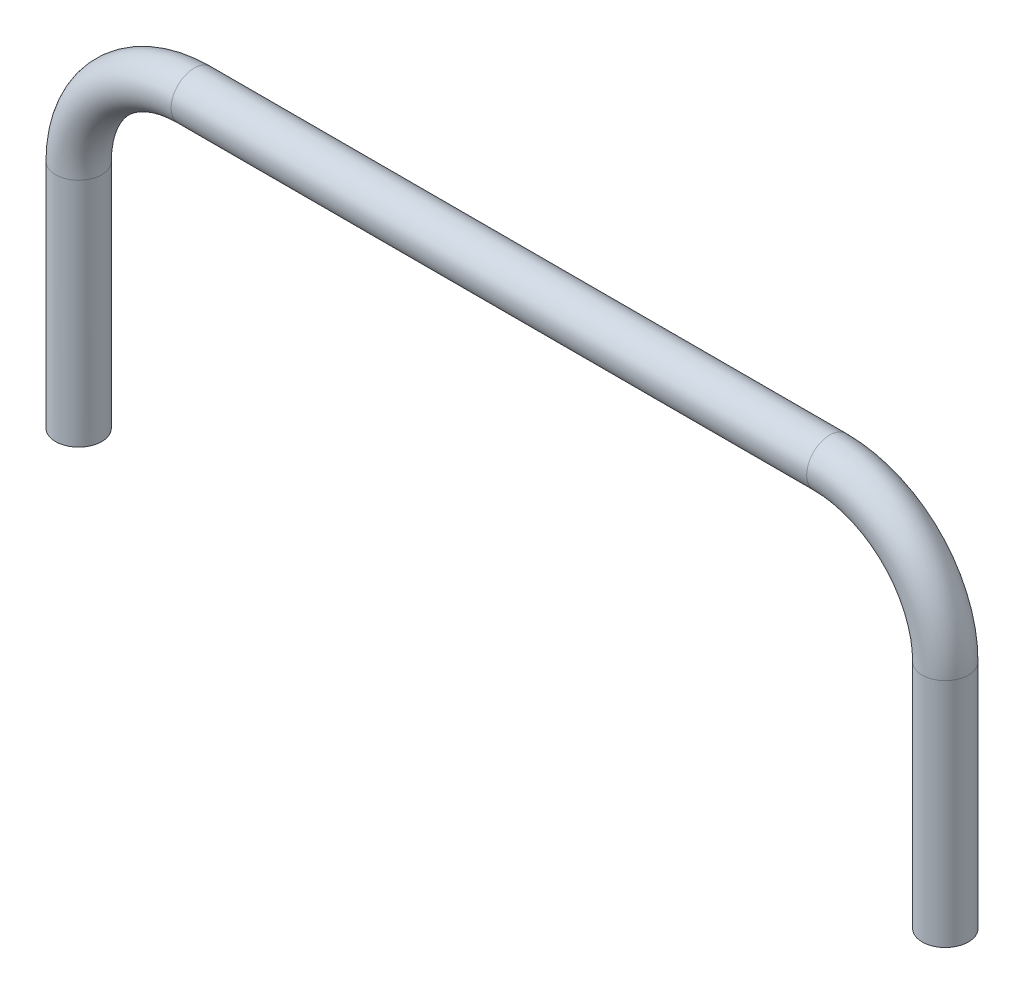
ISO-10303-21;
HEADER;
FILE_DESCRIPTION(('STEP AP214'),'2;1');
FILE_NAME('part.step','',(''),(''),'','','');
FILE_SCHEMA(('AUTOMOTIVE_DESIGN { 1 0 10303 214 1 1 1 1 }'));
ENDSEC;
DATA;
#1=APPLICATION_CONTEXT('core data for automotive mechanical design processes');
#2=APPLICATION_PROTOCOL_DEFINITION('international standard','automotive_design',2000,#1);
#3=PRODUCT_CONTEXT('',#1,'mechanical');
#4=PRODUCT('Part','Part','',(#3));
#5=PRODUCT_RELATED_PRODUCT_CATEGORY('part','',(#4));
#6=PRODUCT_DEFINITION_FORMATION('','',#4);
#7=PRODUCT_DEFINITION_CONTEXT('part definition',#1,'design');
#8=PRODUCT_DEFINITION('design','',#6,#7);
#9=PRODUCT_DEFINITION_SHAPE('','',#8);
#10=(LENGTH_UNIT() NAMED_UNIT(*) SI_UNIT(.MILLI.,.METRE.));
#11=(NAMED_UNIT(*) PLANE_ANGLE_UNIT() SI_UNIT($,.RADIAN.));
#12=(NAMED_UNIT(*) SI_UNIT($,.STERADIAN.) SOLID_ANGLE_UNIT());
#13=UNCERTAINTY_MEASURE_WITH_UNIT(LENGTH_MEASURE(1.E-05),#10,'distance_accuracy_value','');
#14=(GEOMETRIC_REPRESENTATION_CONTEXT(3) GLOBAL_UNCERTAINTY_ASSIGNED_CONTEXT((#13)) GLOBAL_UNIT_ASSIGNED_CONTEXT((#10,
#11,#12)) REPRESENTATION_CONTEXT('',''));
#15=CARTESIAN_POINT('',(0.,0.,0.));
#16=DIRECTION('',(0.,0.,1.));
#17=DIRECTION('',(1.,0.,0.));
#18=AXIS2_PLACEMENT_3D('',#15,#16,#17);
#19=CARTESIAN_POINT('',(-75.,0.,0.));
#20=DIRECTION('',(0.,-1.,0.));
#21=DIRECTION('',(0.,0.,1.));
#22=AXIS2_PLACEMENT_3D('',#19,#20,#21);
#23=PLANE('',#22);
#24=CARTESIAN_POINT('',(-75.,0.,0.));
#25=DIRECTION('',(0.,-1.,0.));
#26=DIRECTION('',(0.,0.,1.));
#27=AXIS2_PLACEMENT_3D('',#24,#25,#26);
#28=CIRCLE('',#27,4.);
#29=CARTESIAN_POINT('',(-75.,0.,4.));
#30=VERTEX_POINT('',#29);
#31=EDGE_CURVE('E71',#30,#30,#28,.T.);
#32=ORIENTED_EDGE('',*,*,#31,.T.);
#33=EDGE_LOOP('',(#32));
#34=FACE_BOUND('',#33,.T.);
#35=ADVANCED_FACE('F49',(#34),#23,.T.);
#36=CARTESIAN_POINT('',(75.,0.,0.));
#37=DIRECTION('',(0.,1.,0.));
#38=DIRECTION('',(0.,0.,1.));
#39=AXIS2_PLACEMENT_3D('',#36,#37,#38);
#40=PLANE('',#39);
#41=CARTESIAN_POINT('',(75.,0.,0.));
#42=DIRECTION('',(0.,1.,0.));
#43=DIRECTION('',(0.,0.,1.));
#44=AXIS2_PLACEMENT_3D('',#41,#42,#43);
#45=CIRCLE('',#44,4.);
#46=CARTESIAN_POINT('',(75.,0.,4.));
#47=VERTEX_POINT('',#46);
#48=EDGE_CURVE('E11',#47,#47,#45,.T.);
#49=ORIENTED_EDGE('',*,*,#48,.F.);
#50=EDGE_LOOP('',(#49));
#51=FACE_BOUND('',#50,.T.);
#52=ADVANCED_FACE('F79',(#51),#40,.F.);
#53=CARTESIAN_POINT('',(-75.,0.,0.));
#54=DIRECTION('',(0.,1.,0.));
#55=DIRECTION('',(-1.,0.,0.));
#56=AXIS2_PLACEMENT_3D('',#53,#54,#55);
#57=CYLINDRICAL_SURFACE('',#56,4.);
#58=CARTESIAN_POINT('',(-75.,40.,0.));
#59=DIRECTION('',(0.,-1.,0.));
#60=DIRECTION('',(0.,0.,1.));
#61=AXIS2_PLACEMENT_3D('',#58,#59,#60);
#62=CIRCLE('',#61,4.);
#63=CARTESIAN_POINT('',(-79.,40.,0.));
#64=VERTEX_POINT('',#63);
#65=EDGE_CURVE('E68',#64,#64,#62,.T.);
#66=ORIENTED_EDGE('',*,*,#65,.T.);
#67=EDGE_LOOP('',(#66));
#68=FACE_BOUND('',#67,.T.);
#69=ORIENTED_EDGE('',*,*,#31,.F.);
#70=EDGE_LOOP('',(#69));
#71=FACE_BOUND('',#70,.T.);
#72=ADVANCED_FACE('F76',(#68,#71),#57,.T.);
#73=CARTESIAN_POINT('',(-55.,40.,0.));
#74=DIRECTION('',(0.,0.,-1.));
#75=DIRECTION('',(-1.,0.,0.));
#76=AXIS2_PLACEMENT_3D('',#73,#74,#75);
#77=TOROIDAL_SURFACE('',#76,20.,4.);
#78=CARTESIAN_POINT('',(-55.,60.,0.));
#79=DIRECTION('',(-1.,0.,0.));
#80=DIRECTION('',(0.,0.,1.));
#81=AXIS2_PLACEMENT_3D('',#78,#79,#80);
#82=CIRCLE('',#81,4.);
#83=CARTESIAN_POINT('',(-55.,64.,0.));
#84=VERTEX_POINT('',#83);
#85=EDGE_CURVE('E63',#84,#84,#82,.T.);
#86=CARTESIAN_POINT('',(-55.,40.,0.));
#87=DIRECTION('',(0.,0.,-1.));
#88=DIRECTION('',(-1.,0.,0.));
#89=AXIS2_PLACEMENT_3D('',#86,#87,#88);
#90=CIRCLE('',#89,24.);
#91=EDGE_CURVE('',#64,#84,#90,.T.);
#92=ORIENTED_EDGE('',*,*,#65,.F.);
#93=ORIENTED_EDGE('',*,*,#85,.T.);
#94=ORIENTED_EDGE('',*,*,#91,.T.);
#95=ORIENTED_EDGE('',*,*,#91,.F.);
#96=EDGE_LOOP('',(#92,#94,#93,#95));
#97=FACE_BOUND('',#96,.T.);
#98=ADVANCED_FACE('F78',(#97),#77,.T.);
#99=CARTESIAN_POINT('',(-55.,60.,0.));
#100=DIRECTION('',(1.,0.,0.));
#101=DIRECTION('',(0.,0.,-1.));
#102=AXIS2_PLACEMENT_3D('',#99,#100,#101);
#103=CYLINDRICAL_SURFACE('',#102,4.);
#104=CARTESIAN_POINT('',(55.,60.,0.));
#105=DIRECTION('',(-1.,0.,0.));
#106=DIRECTION('',(0.,0.,1.));
#107=AXIS2_PLACEMENT_3D('',#104,#105,#106);
#108=CIRCLE('',#107,4.);
#109=CARTESIAN_POINT('',(54.9999999999999,64.,0.));
#110=VERTEX_POINT('',#109);
#111=EDGE_CURVE('E59',#110,#110,#108,.T.);
#112=ORIENTED_EDGE('',*,*,#111,.T.);
#113=EDGE_LOOP('',(#112));
#114=FACE_BOUND('',#113,.T.);
#115=ORIENTED_EDGE('',*,*,#85,.F.);
#116=EDGE_LOOP('',(#115));
#117=FACE_BOUND('',#116,.T.);
#118=ADVANCED_FACE('F86',(#114,#117),#103,.T.);
#119=CARTESIAN_POINT('',(55.,40.,0.));
#120=DIRECTION('',(0.,0.,-1.));
#121=DIRECTION('',(-1.,0.,0.));
#122=AXIS2_PLACEMENT_3D('',#119,#120,#121);
#123=TOROIDAL_SURFACE('',#122,20.,4.);
#124=CARTESIAN_POINT('',(75.,40.,0.));
#125=DIRECTION('',(0.,1.,0.));
#126=DIRECTION('',(0.,0.,1.));
#127=AXIS2_PLACEMENT_3D('',#124,#125,#126);
#128=CIRCLE('',#127,4.);
#129=CARTESIAN_POINT('',(79.,40.,0.));
#130=VERTEX_POINT('',#129);
#131=EDGE_CURVE('E55',#130,#130,#128,.T.);
#132=CARTESIAN_POINT('',(55.,40.,0.));
#133=DIRECTION('',(0.,0.,-1.));
#134=DIRECTION('',(-1.,0.,0.));
#135=AXIS2_PLACEMENT_3D('',#132,#133,#134);
#136=CIRCLE('',#135,24.);
#137=EDGE_CURVE('',#110,#130,#136,.T.);
#138=ORIENTED_EDGE('',*,*,#111,.F.);
#139=ORIENTED_EDGE('',*,*,#131,.T.);
#140=ORIENTED_EDGE('',*,*,#137,.T.);
#141=ORIENTED_EDGE('',*,*,#137,.F.);
#142=EDGE_LOOP('',(#138,#140,#139,#141));
#143=FACE_BOUND('',#142,.T.);
#144=ADVANCED_FACE('F92',(#143),#123,.T.);
#145=CARTESIAN_POINT('',(75.,40.,0.));
#146=DIRECTION('',(0.,-1.,0.));
#147=DIRECTION('',(1.,0.,0.));
#148=AXIS2_PLACEMENT_3D('',#145,#146,#147);
#149=CYLINDRICAL_SURFACE('',#148,4.);
#150=ORIENTED_EDGE('',*,*,#48,.T.);
#151=EDGE_LOOP('',(#150));
#152=FACE_BOUND('',#151,.T.);
#153=ORIENTED_EDGE('',*,*,#131,.F.);
#154=EDGE_LOOP('',(#153));
#155=FACE_BOUND('',#154,.T.);
#156=ADVANCED_FACE('F90',(#152,#155),#149,.T.);
#157=CLOSED_SHELL('',(#35,#52,#72,#98,#118,#144,#156));
#158=MANIFOLD_SOLID_BREP('B2',#157);
#159=ADVANCED_BREP_SHAPE_REPRESENTATION('',(#18,#158),#14);
#160=SHAPE_DEFINITION_REPRESENTATION(#9,#159);
ENDSEC;
END-ISO-10303-21;
